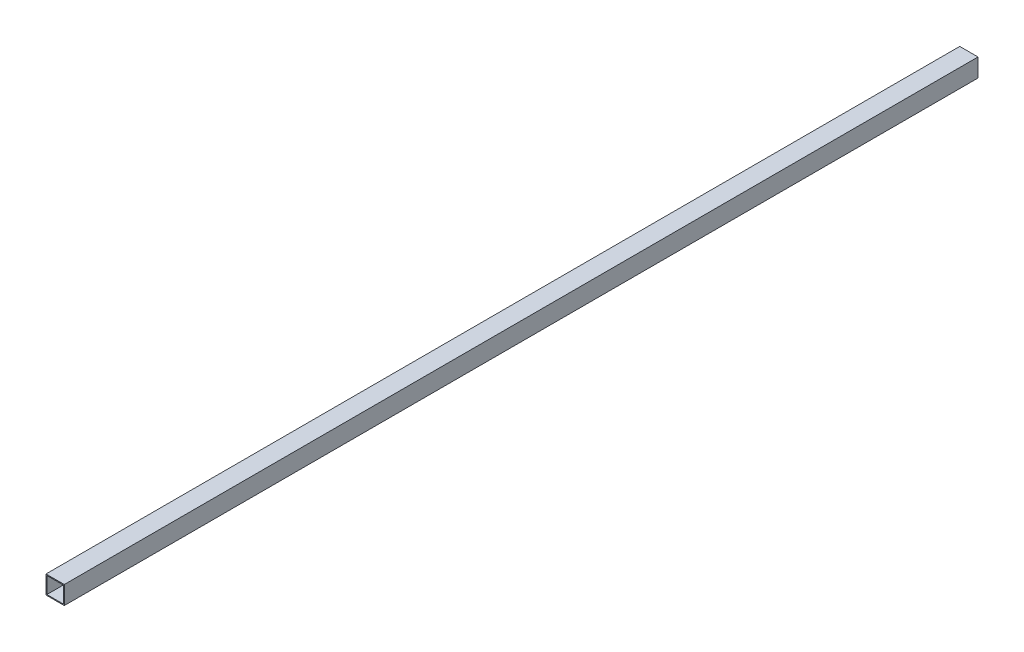
ISO-10303-21;
HEADER;
FILE_DESCRIPTION(('STEP AP214'),'2;1');
FILE_NAME('part.step','',(''),(''),'','','');
FILE_SCHEMA(('AUTOMOTIVE_DESIGN { 1 0 10303 214 1 1 1 1 }'));
ENDSEC;
DATA;
#1=APPLICATION_CONTEXT('core data for automotive mechanical design processes');
#2=APPLICATION_PROTOCOL_DEFINITION('international standard','automotive_design',2000,#1);
#3=PRODUCT_CONTEXT('',#1,'mechanical');
#4=PRODUCT('Part','Part','',(#3));
#5=PRODUCT_RELATED_PRODUCT_CATEGORY('part','',(#4));
#6=PRODUCT_DEFINITION_FORMATION('','',#4);
#7=PRODUCT_DEFINITION_CONTEXT('part definition',#1,'design');
#8=PRODUCT_DEFINITION('design','',#6,#7);
#9=PRODUCT_DEFINITION_SHAPE('','',#8);
#10=(LENGTH_UNIT() NAMED_UNIT(*) SI_UNIT(.MILLI.,.METRE.));
#11=(NAMED_UNIT(*) PLANE_ANGLE_UNIT() SI_UNIT($,.RADIAN.));
#12=(NAMED_UNIT(*) SI_UNIT($,.STERADIAN.) SOLID_ANGLE_UNIT());
#13=UNCERTAINTY_MEASURE_WITH_UNIT(LENGTH_MEASURE(1.E-05),#10,'distance_accuracy_value','');
#14=(GEOMETRIC_REPRESENTATION_CONTEXT(3) GLOBAL_UNCERTAINTY_ASSIGNED_CONTEXT((#13)) GLOBAL_UNIT_ASSIGNED_CONTEXT((#10,
#11,#12)) REPRESENTATION_CONTEXT('',''));
#15=CARTESIAN_POINT('',(0.,0.,0.));
#16=DIRECTION('',(0.,0.,1.));
#17=DIRECTION('',(1.,0.,0.));
#18=AXIS2_PLACEMENT_3D('',#15,#16,#17);
#19=CARTESIAN_POINT('',(0.,0.,1000.));
#20=DIRECTION('',(0.,0.,1.));
#21=DIRECTION('',(1.,0.,0.));
#22=AXIS2_PLACEMENT_3D('',#19,#20,#21);
#23=PLANE('',#22);
#24=DIRECTION('',(0.,-1.,0.));
#25=VECTOR('',#24,1.);
#26=CARTESIAN_POINT('',(0.,0.,1000.));
#27=LINE('',#26,#25);
#28=CARTESIAN_POINT('',(0.,0.,1000.));
#29=VERTEX_POINT('',#28);
#30=CARTESIAN_POINT('',(0.,-20.,1000.));
#31=VERTEX_POINT('',#30);
#32=EDGE_CURVE('E136',#29,#31,#27,.T.);
#33=ORIENTED_EDGE('',*,*,#32,.T.);
#34=DIRECTION('',(1.,0.,0.));
#35=VECTOR('',#34,1.);
#36=CARTESIAN_POINT('',(0.,-20.,1000.));
#37=LINE('',#36,#35);
#38=CARTESIAN_POINT('',(20.,-20.,1000.));
#39=VERTEX_POINT('',#38);
#40=EDGE_CURVE('E139',#31,#39,#37,.T.);
#41=ORIENTED_EDGE('',*,*,#40,.T.);
#42=DIRECTION('',(0.,1.,0.));
#43=VECTOR('',#42,1.);
#44=CARTESIAN_POINT('',(20.,0.,1000.));
#45=LINE('',#44,#43);
#46=CARTESIAN_POINT('',(20.,0.,1000.));
#47=VERTEX_POINT('',#46);
#48=EDGE_CURVE('E142',#39,#47,#45,.T.);
#49=ORIENTED_EDGE('',*,*,#48,.T.);
#50=DIRECTION('',(-1.,0.,0.));
#51=VECTOR('',#50,1.);
#52=CARTESIAN_POINT('',(0.,0.,1000.));
#53=LINE('',#52,#51);
#54=EDGE_CURVE('E144',#47,#29,#53,.T.);
#55=ORIENTED_EDGE('',*,*,#54,.T.);
#56=EDGE_LOOP('',(#33,#41,#49,#55));
#57=FACE_BOUND('',#56,.T.);
#58=DIRECTION('',(-1.,0.,0.));
#59=VECTOR('',#58,1.);
#60=CARTESIAN_POINT('',(1.,-1.,1000.));
#61=LINE('',#60,#59);
#62=CARTESIAN_POINT('',(19.,-1.,1000.));
#63=VERTEX_POINT('',#62);
#64=CARTESIAN_POINT('',(1.,-1.,1000.));
#65=VERTEX_POINT('',#64);
#66=EDGE_CURVE('E108',#63,#65,#61,.T.);
#67=ORIENTED_EDGE('',*,*,#66,.F.);
#68=DIRECTION('',(0.,1.,0.));
#69=VECTOR('',#68,1.);
#70=CARTESIAN_POINT('',(19.,-19.,1000.));
#71=LINE('',#70,#69);
#72=CARTESIAN_POINT('',(19.,-19.,1000.));
#73=VERTEX_POINT('',#72);
#74=EDGE_CURVE('E100',#73,#63,#71,.T.);
#75=ORIENTED_EDGE('',*,*,#74,.F.);
#76=DIRECTION('',(1.,0.,0.));
#77=VECTOR('',#76,1.);
#78=CARTESIAN_POINT('',(1.,-19.,1000.));
#79=LINE('',#78,#77);
#80=CARTESIAN_POINT('',(1.,-19.,1000.));
#81=VERTEX_POINT('',#80);
#82=EDGE_CURVE('E122',#81,#73,#79,.T.);
#83=ORIENTED_EDGE('',*,*,#82,.F.);
#84=DIRECTION('',(0.,-1.,0.));
#85=VECTOR('',#84,1.);
#86=CARTESIAN_POINT('',(1.,-19.,1000.));
#87=LINE('',#86,#85);
#88=EDGE_CURVE('E120',#65,#81,#87,.T.);
#89=ORIENTED_EDGE('',*,*,#88,.F.);
#90=EDGE_LOOP('',(#67,#75,#83,#89));
#91=FACE_BOUND('',#90,.T.);
#92=ADVANCED_FACE('F35',(#57,#91),#23,.T.);
#93=CARTESIAN_POINT('',(0.,0.,0.));
#94=DIRECTION('',(0.,0.,1.));
#95=DIRECTION('',(1.,0.,0.));
#96=AXIS2_PLACEMENT_3D('',#93,#94,#95);
#97=PLANE('',#96);
#98=DIRECTION('',(0.,-1.,0.));
#99=VECTOR('',#98,1.);
#100=CARTESIAN_POINT('',(0.,0.,0.));
#101=LINE('',#100,#99);
#102=CARTESIAN_POINT('',(0.,0.,0.));
#103=VERTEX_POINT('',#102);
#104=CARTESIAN_POINT('',(0.,-20.,0.));
#105=VERTEX_POINT('',#104);
#106=EDGE_CURVE('E116',#103,#105,#101,.T.);
#107=ORIENTED_EDGE('',*,*,#106,.F.);
#108=DIRECTION('',(-1.,0.,0.));
#109=VECTOR('',#108,1.);
#110=CARTESIAN_POINT('',(0.,0.,0.));
#111=LINE('',#110,#109);
#112=CARTESIAN_POINT('',(20.,0.,0.));
#113=VERTEX_POINT('',#112);
#114=EDGE_CURVE('E140',#113,#103,#111,.T.);
#115=ORIENTED_EDGE('',*,*,#114,.F.);
#116=DIRECTION('',(0.,1.,0.));
#117=VECTOR('',#116,1.);
#118=CARTESIAN_POINT('',(20.,0.,0.));
#119=LINE('',#118,#117);
#120=CARTESIAN_POINT('',(20.,-20.,0.));
#121=VERTEX_POINT('',#120);
#122=EDGE_CURVE('E151',#121,#113,#119,.T.);
#123=ORIENTED_EDGE('',*,*,#122,.F.);
#124=DIRECTION('',(1.,0.,0.));
#125=VECTOR('',#124,1.);
#126=CARTESIAN_POINT('',(0.,-20.,0.));
#127=LINE('',#126,#125);
#128=EDGE_CURVE('E149',#105,#121,#127,.T.);
#129=ORIENTED_EDGE('',*,*,#128,.F.);
#130=EDGE_LOOP('',(#107,#115,#123,#129));
#131=FACE_BOUND('',#130,.T.);
#132=DIRECTION('',(0.,1.,0.));
#133=VECTOR('',#132,1.);
#134=CARTESIAN_POINT('',(19.,-19.,0.));
#135=LINE('',#134,#133);
#136=CARTESIAN_POINT('',(19.,-19.,0.));
#137=VERTEX_POINT('',#136);
#138=CARTESIAN_POINT('',(19.,-1.,0.));
#139=VERTEX_POINT('',#138);
#140=EDGE_CURVE('E58',#137,#139,#135,.T.);
#141=ORIENTED_EDGE('',*,*,#140,.T.);
#142=DIRECTION('',(-1.,0.,0.));
#143=VECTOR('',#142,1.);
#144=CARTESIAN_POINT('',(1.,-1.,0.));
#145=LINE('',#144,#143);
#146=CARTESIAN_POINT('',(1.,-1.,0.));
#147=VERTEX_POINT('',#146);
#148=EDGE_CURVE('E115',#139,#147,#145,.T.);
#149=ORIENTED_EDGE('',*,*,#148,.T.);
#150=DIRECTION('',(0.,-1.,0.));
#151=VECTOR('',#150,1.);
#152=CARTESIAN_POINT('',(1.,-19.,0.));
#153=LINE('',#152,#151);
#154=CARTESIAN_POINT('',(1.,-19.,0.));
#155=VERTEX_POINT('',#154);
#156=EDGE_CURVE('E128',#147,#155,#153,.T.);
#157=ORIENTED_EDGE('',*,*,#156,.T.);
#158=DIRECTION('',(1.,0.,0.));
#159=VECTOR('',#158,1.);
#160=CARTESIAN_POINT('',(1.,-19.,0.));
#161=LINE('',#160,#159);
#162=EDGE_CURVE('E109',#155,#137,#161,.T.);
#163=ORIENTED_EDGE('',*,*,#162,.T.);
#164=EDGE_LOOP('',(#141,#149,#157,#163));
#165=FACE_BOUND('',#164,.T.);
#166=ADVANCED_FACE('F169',(#131,#165),#97,.F.);
#167=CARTESIAN_POINT('',(0.,0.,1000.));
#168=DIRECTION('',(1.,0.,0.));
#169=DIRECTION('',(0.,0.,-1.));
#170=AXIS2_PLACEMENT_3D('',#167,#168,#169);
#171=PLANE('',#170);
#172=ORIENTED_EDGE('',*,*,#106,.T.);
#173=DIRECTION('',(0.,0.,-1.));
#174=VECTOR('',#173,1.);
#175=CARTESIAN_POINT('',(0.,-20.,1000.));
#176=LINE('',#175,#174);
#177=EDGE_CURVE('E11',#31,#105,#176,.T.);
#178=ORIENTED_EDGE('',*,*,#177,.F.);
#179=ORIENTED_EDGE('',*,*,#32,.F.);
#180=DIRECTION('',(0.,0.,-1.));
#181=VECTOR('',#180,1.);
#182=CARTESIAN_POINT('',(0.,0.,1000.));
#183=LINE('',#182,#181);
#184=EDGE_CURVE('E146',#29,#103,#183,.T.);
#185=ORIENTED_EDGE('',*,*,#184,.T.);
#186=EDGE_LOOP('',(#172,#178,#179,#185));
#187=FACE_BOUND('',#186,.T.);
#188=ADVANCED_FACE('F37',(#187),#171,.F.);
#189=CARTESIAN_POINT('',(0.,-20.,1000.));
#190=DIRECTION('',(0.,1.,0.));
#191=DIRECTION('',(0.,0.,1.));
#192=AXIS2_PLACEMENT_3D('',#189,#190,#191);
#193=PLANE('',#192);
#194=ORIENTED_EDGE('',*,*,#128,.T.);
#195=DIRECTION('',(0.,0.,-1.));
#196=VECTOR('',#195,1.);
#197=CARTESIAN_POINT('',(20.,-20.,1000.));
#198=LINE('',#197,#196);
#199=EDGE_CURVE('E43',#39,#121,#198,.T.);
#200=ORIENTED_EDGE('',*,*,#199,.F.);
#201=ORIENTED_EDGE('',*,*,#40,.F.);
#202=ORIENTED_EDGE('',*,*,#177,.T.);
#203=EDGE_LOOP('',(#194,#200,#201,#202));
#204=FACE_BOUND('',#203,.T.);
#205=ADVANCED_FACE('F179',(#204),#193,.F.);
#206=CARTESIAN_POINT('',(20.,0.,1000.));
#207=DIRECTION('',(-1.,0.,0.));
#208=DIRECTION('',(0.,-1.,0.));
#209=AXIS2_PLACEMENT_3D('',#206,#207,#208);
#210=PLANE('',#209);
#211=ORIENTED_EDGE('',*,*,#122,.T.);
#212=DIRECTION('',(0.,0.,-1.));
#213=VECTOR('',#212,1.);
#214=CARTESIAN_POINT('',(20.,0.,1000.));
#215=LINE('',#214,#213);
#216=EDGE_CURVE('E156',#47,#113,#215,.T.);
#217=ORIENTED_EDGE('',*,*,#216,.F.);
#218=ORIENTED_EDGE('',*,*,#48,.F.);
#219=ORIENTED_EDGE('',*,*,#199,.T.);
#220=EDGE_LOOP('',(#211,#217,#218,#219));
#221=FACE_BOUND('',#220,.T.);
#222=ADVANCED_FACE('F163',(#221),#210,.F.);
#223=CARTESIAN_POINT('',(0.,0.,1000.));
#224=DIRECTION('',(0.,-1.,0.));
#225=DIRECTION('',(0.,0.,-1.));
#226=AXIS2_PLACEMENT_3D('',#223,#224,#225);
#227=PLANE('',#226);
#228=ORIENTED_EDGE('',*,*,#114,.T.);
#229=ORIENTED_EDGE('',*,*,#184,.F.);
#230=ORIENTED_EDGE('',*,*,#54,.F.);
#231=ORIENTED_EDGE('',*,*,#216,.T.);
#232=EDGE_LOOP('',(#228,#229,#230,#231));
#233=FACE_BOUND('',#232,.T.);
#234=ADVANCED_FACE('F173',(#233),#227,.F.);
#235=CARTESIAN_POINT('',(19.,-19.,1000.));
#236=DIRECTION('',(-1.,0.,0.));
#237=DIRECTION('',(0.,0.,1.));
#238=AXIS2_PLACEMENT_3D('',#235,#236,#237);
#239=PLANE('',#238);
#240=ORIENTED_EDGE('',*,*,#140,.F.);
#241=DIRECTION('',(0.,0.,-1.));
#242=VECTOR('',#241,1.);
#243=CARTESIAN_POINT('',(19.,-19.,1000.));
#244=LINE('',#243,#242);
#245=EDGE_CURVE('E104',#73,#137,#244,.T.);
#246=ORIENTED_EDGE('',*,*,#245,.F.);
#247=ORIENTED_EDGE('',*,*,#74,.T.);
#248=DIRECTION('',(0.,0.,-1.));
#249=VECTOR('',#248,1.);
#250=CARTESIAN_POINT('',(19.,-1.,1000.));
#251=LINE('',#250,#249);
#252=EDGE_CURVE('E103',#63,#139,#251,.T.);
#253=ORIENTED_EDGE('',*,*,#252,.T.);
#254=EDGE_LOOP('',(#240,#246,#247,#253));
#255=FACE_BOUND('',#254,.T.);
#256=ADVANCED_FACE('F102',(#255),#239,.T.);
#257=CARTESIAN_POINT('',(1.,-1.,1000.));
#258=DIRECTION('',(0.,-1.,0.));
#259=DIRECTION('',(0.,0.,-1.));
#260=AXIS2_PLACEMENT_3D('',#257,#258,#259);
#261=PLANE('',#260);
#262=ORIENTED_EDGE('',*,*,#148,.F.);
#263=ORIENTED_EDGE('',*,*,#252,.F.);
#264=ORIENTED_EDGE('',*,*,#66,.T.);
#265=DIRECTION('',(0.,0.,-1.));
#266=VECTOR('',#265,1.);
#267=CARTESIAN_POINT('',(1.,-1.,1000.));
#268=LINE('',#267,#266);
#269=EDGE_CURVE('E117',#65,#147,#268,.T.);
#270=ORIENTED_EDGE('',*,*,#269,.T.);
#271=EDGE_LOOP('',(#262,#263,#264,#270));
#272=FACE_BOUND('',#271,.T.);
#273=ADVANCED_FACE('F112',(#272),#261,.T.);
#274=CARTESIAN_POINT('',(1.,-19.,1000.));
#275=DIRECTION('',(1.,0.,0.));
#276=DIRECTION('',(0.,0.,-1.));
#277=AXIS2_PLACEMENT_3D('',#274,#275,#276);
#278=PLANE('',#277);
#279=ORIENTED_EDGE('',*,*,#156,.F.);
#280=ORIENTED_EDGE('',*,*,#269,.F.);
#281=ORIENTED_EDGE('',*,*,#88,.T.);
#282=DIRECTION('',(0.,0.,-1.));
#283=VECTOR('',#282,1.);
#284=CARTESIAN_POINT('',(1.,-19.,1000.));
#285=LINE('',#284,#283);
#286=EDGE_CURVE('E50',#81,#155,#285,.T.);
#287=ORIENTED_EDGE('',*,*,#286,.T.);
#288=EDGE_LOOP('',(#279,#280,#281,#287));
#289=FACE_BOUND('',#288,.T.);
#290=ADVANCED_FACE('F202',(#289),#278,.T.);
#291=CARTESIAN_POINT('',(1.,-19.,1000.));
#292=DIRECTION('',(0.,1.,0.));
#293=DIRECTION('',(0.,0.,1.));
#294=AXIS2_PLACEMENT_3D('',#291,#292,#293);
#295=PLANE('',#294);
#296=ORIENTED_EDGE('',*,*,#162,.F.);
#297=ORIENTED_EDGE('',*,*,#286,.F.);
#298=ORIENTED_EDGE('',*,*,#82,.T.);
#299=ORIENTED_EDGE('',*,*,#245,.T.);
#300=EDGE_LOOP('',(#296,#297,#298,#299));
#301=FACE_BOUND('',#300,.T.);
#302=ADVANCED_FACE('F206',(#301),#295,.T.);
#303=CLOSED_SHELL('',(#92,#166,#188,#205,#222,#234,#256,#273,#290,#302));
#304=MANIFOLD_SOLID_BREP('B2',#303);
#305=ADVANCED_BREP_SHAPE_REPRESENTATION('',(#18,#304),#14);
#306=SHAPE_DEFINITION_REPRESENTATION(#9,#305);
ENDSEC;
END-ISO-10303-21;
